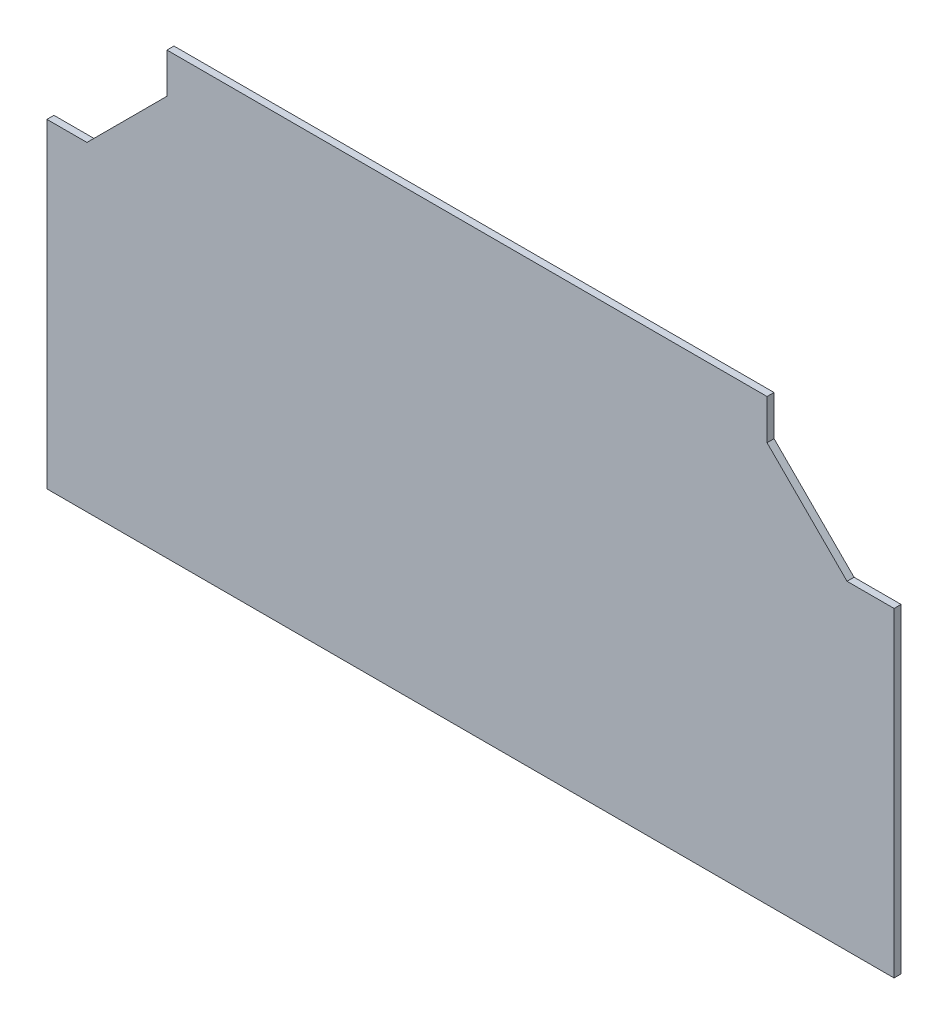
ISO-10303-21;
HEADER;
FILE_DESCRIPTION(('STEP AP214'),'2;1');
FILE_NAME('part.step','',(''),(''),'','','');
FILE_SCHEMA(('AUTOMOTIVE_DESIGN { 1 0 10303 214 1 1 1 1 }'));
ENDSEC;
DATA;
#1=APPLICATION_CONTEXT('core data for automotive mechanical design processes');
#2=APPLICATION_PROTOCOL_DEFINITION('international standard','automotive_design',2000,#1);
#3=PRODUCT_CONTEXT('',#1,'mechanical');
#4=PRODUCT('Part','Part','',(#3));
#5=PRODUCT_RELATED_PRODUCT_CATEGORY('part','',(#4));
#6=PRODUCT_DEFINITION_FORMATION('','',#4);
#7=PRODUCT_DEFINITION_CONTEXT('part definition',#1,'design');
#8=PRODUCT_DEFINITION('design','',#6,#7);
#9=PRODUCT_DEFINITION_SHAPE('','',#8);
#10=(LENGTH_UNIT() NAMED_UNIT(*) SI_UNIT(.MILLI.,.METRE.));
#11=(NAMED_UNIT(*) PLANE_ANGLE_UNIT() SI_UNIT($,.RADIAN.));
#12=(NAMED_UNIT(*) SI_UNIT($,.STERADIAN.) SOLID_ANGLE_UNIT());
#13=UNCERTAINTY_MEASURE_WITH_UNIT(LENGTH_MEASURE(1.E-05),#10,'distance_accuracy_value','');
#14=(GEOMETRIC_REPRESENTATION_CONTEXT(3) GLOBAL_UNCERTAINTY_ASSIGNED_CONTEXT((#13)) GLOBAL_UNIT_ASSIGNED_CONTEXT((#10,
#11,#12)) REPRESENTATION_CONTEXT('',''));
#15=CARTESIAN_POINT('',(0.,0.,0.));
#16=DIRECTION('',(0.,0.,1.));
#17=DIRECTION('',(1.,0.,0.));
#18=AXIS2_PLACEMENT_3D('',#15,#16,#17);
#19=CARTESIAN_POINT('',(423.500000000001,-60.0000000000006,3.5));
#20=DIRECTION('',(-1.,0.,0.));
#21=DIRECTION('',(0.,-1.,0.));
#22=AXIS2_PLACEMENT_3D('',#19,#20,#21);
#23=PLANE('',#22);
#24=DIRECTION('',(0.,1.,0.));
#25=VECTOR('',#24,1.);
#26=CARTESIAN_POINT('',(423.500000000001,-60.0000000000006,0.));
#27=LINE('',#26,#25);
#28=CARTESIAN_POINT('',(423.5,-220.,0.));
#29=VERTEX_POINT('',#28);
#30=CARTESIAN_POINT('',(423.500000000001,-60.0000000000006,0.));
#31=VERTEX_POINT('',#30);
#32=EDGE_CURVE('E140',#29,#31,#27,.T.);
#33=ORIENTED_EDGE('',*,*,#32,.T.);
#34=DIRECTION('',(0.,0.,-1.));
#35=VECTOR('',#34,1.);
#36=CARTESIAN_POINT('',(423.500000000001,-60.0000000000006,3.5));
#37=LINE('',#36,#35);
#38=CARTESIAN_POINT('',(423.500000000001,-60.0000000000006,3.5));
#39=VERTEX_POINT('',#38);
#40=EDGE_CURVE('E11',#39,#31,#37,.T.);
#41=ORIENTED_EDGE('',*,*,#40,.F.);
#42=DIRECTION('',(0.,1.,0.));
#43=VECTOR('',#42,1.);
#44=CARTESIAN_POINT('',(423.500000000001,-60.0000000000006,3.5));
#45=LINE('',#44,#43);
#46=CARTESIAN_POINT('',(423.5,-220.,3.5));
#47=VERTEX_POINT('',#46);
#48=EDGE_CURVE('E158',#47,#39,#45,.T.);
#49=ORIENTED_EDGE('',*,*,#48,.F.);
#50=DIRECTION('',(0.,0.,-1.));
#51=VECTOR('',#50,1.);
#52=CARTESIAN_POINT('',(423.5,-220.,3.5));
#53=LINE('',#52,#51);
#54=EDGE_CURVE('E136',#47,#29,#53,.T.);
#55=ORIENTED_EDGE('',*,*,#54,.T.);
#56=EDGE_LOOP('',(#33,#41,#49,#55));
#57=FACE_BOUND('',#56,.T.);
#58=ADVANCED_FACE('F32',(#57),#23,.F.);
#59=CARTESIAN_POINT('',(400.000000000001,-59.9999999999997,3.5));
#60=DIRECTION('',(0.,-1.,0.));
#61=DIRECTION('',(1.,0.,0.));
#62=AXIS2_PLACEMENT_3D('',#59,#60,#61);
#63=PLANE('',#62);
#64=DIRECTION('',(-1.,0.,0.));
#65=VECTOR('',#64,1.);
#66=CARTESIAN_POINT('',(400.000000000001,-59.9999999999997,0.));
#67=LINE('',#66,#65);
#68=CARTESIAN_POINT('',(400.000000000001,-59.9999999999997,0.));
#69=VERTEX_POINT('',#68);
#70=EDGE_CURVE('E143',#31,#69,#67,.T.);
#71=ORIENTED_EDGE('',*,*,#70,.T.);
#72=DIRECTION('',(0.,0.,-1.));
#73=VECTOR('',#72,1.);
#74=CARTESIAN_POINT('',(400.000000000001,-59.9999999999997,3.5));
#75=LINE('',#74,#73);
#76=CARTESIAN_POINT('',(400.000000000001,-59.9999999999997,3.5));
#77=VERTEX_POINT('',#76);
#78=EDGE_CURVE('E40',#77,#69,#75,.T.);
#79=ORIENTED_EDGE('',*,*,#78,.F.);
#80=DIRECTION('',(-1.,0.,0.));
#81=VECTOR('',#80,1.);
#82=CARTESIAN_POINT('',(400.000000000001,-59.9999999999997,3.5));
#83=LINE('',#82,#81);
#84=EDGE_CURVE('E97',#39,#77,#83,.T.);
#85=ORIENTED_EDGE('',*,*,#84,.F.);
#86=ORIENTED_EDGE('',*,*,#40,.T.);
#87=EDGE_LOOP('',(#71,#79,#85,#86));
#88=FACE_BOUND('',#87,.T.);
#89=ADVANCED_FACE('F207',(#88),#63,.F.);
#90=CARTESIAN_POINT('',(360.,-19.9999999999996,3.5));
#91=DIRECTION('',(-0.707106781186539,-0.707106781186556,0.));
#92=DIRECTION('',(0.707106781186556,-0.707106781186539,0.));
#93=AXIS2_PLACEMENT_3D('',#90,#91,#92);
#94=PLANE('',#93);
#95=DIRECTION('',(-0.707106781186556,0.707106781186539,0.));
#96=VECTOR('',#95,1.);
#97=CARTESIAN_POINT('',(360.,-19.9999999999996,0.));
#98=LINE('',#97,#96);
#99=CARTESIAN_POINT('',(360.,-19.9999999999996,0.));
#100=VERTEX_POINT('',#99);
#101=EDGE_CURVE('E145',#69,#100,#98,.T.);
#102=ORIENTED_EDGE('',*,*,#101,.T.);
#103=DIRECTION('',(0.,0.,-1.));
#104=VECTOR('',#103,1.);
#105=CARTESIAN_POINT('',(360.,-19.9999999999996,3.5));
#106=LINE('',#105,#104);
#107=CARTESIAN_POINT('',(360.,-19.9999999999996,3.5));
#108=VERTEX_POINT('',#107);
#109=EDGE_CURVE('E171',#108,#100,#106,.T.);
#110=ORIENTED_EDGE('',*,*,#109,.F.);
#111=DIRECTION('',(-0.707106781186556,0.707106781186539,0.));
#112=VECTOR('',#111,1.);
#113=CARTESIAN_POINT('',(360.,-19.9999999999996,3.5));
#114=LINE('',#113,#112);
#115=EDGE_CURVE('E179',#77,#108,#114,.T.);
#116=ORIENTED_EDGE('',*,*,#115,.F.);
#117=ORIENTED_EDGE('',*,*,#78,.T.);
#118=EDGE_LOOP('',(#102,#110,#116,#117));
#119=FACE_BOUND('',#118,.T.);
#120=ADVANCED_FACE('F177',(#119),#94,.F.);
#121=CARTESIAN_POINT('',(360.,3.74779527702149E-13,3.5));
#122=DIRECTION('',(-1.,0.,0.));
#123=DIRECTION('',(0.,-1.,0.));
#124=AXIS2_PLACEMENT_3D('',#121,#122,#123);
#125=PLANE('',#124);
#126=DIRECTION('',(0.,1.,0.));
#127=VECTOR('',#126,1.);
#128=CARTESIAN_POINT('',(360.,3.74779527702149E-13,0.));
#129=LINE('',#128,#127);
#130=CARTESIAN_POINT('',(360.,3.74779527702149E-13,0.));
#131=VERTEX_POINT('',#130);
#132=EDGE_CURVE('E147',#100,#131,#129,.T.);
#133=ORIENTED_EDGE('',*,*,#132,.T.);
#134=DIRECTION('',(0.,0.,-1.));
#135=VECTOR('',#134,1.);
#136=CARTESIAN_POINT('',(360.,3.74779527702149E-13,3.5));
#137=LINE('',#136,#135);
#138=CARTESIAN_POINT('',(360.,3.74779527702149E-13,3.5));
#139=VERTEX_POINT('',#138);
#140=EDGE_CURVE('E168',#139,#131,#137,.T.);
#141=ORIENTED_EDGE('',*,*,#140,.F.);
#142=DIRECTION('',(0.,1.,0.));
#143=VECTOR('',#142,1.);
#144=CARTESIAN_POINT('',(360.,3.74779527702149E-13,3.5));
#145=LINE('',#144,#143);
#146=EDGE_CURVE('E197',#108,#139,#145,.T.);
#147=ORIENTED_EDGE('',*,*,#146,.F.);
#148=ORIENTED_EDGE('',*,*,#109,.T.);
#149=EDGE_LOOP('',(#133,#141,#147,#148));
#150=FACE_BOUND('',#149,.T.);
#151=ADVANCED_FACE('F188',(#150),#125,.F.);
#152=CARTESIAN_POINT('',(60.,0.,3.5));
#153=DIRECTION('',(0.,-1.,0.));
#154=DIRECTION('',(1.,0.,0.));
#155=AXIS2_PLACEMENT_3D('',#152,#153,#154);
#156=PLANE('',#155);
#157=DIRECTION('',(-1.,0.,0.));
#158=VECTOR('',#157,1.);
#159=CARTESIAN_POINT('',(60.,0.,0.));
#160=LINE('',#159,#158);
#161=CARTESIAN_POINT('',(60.,0.,0.));
#162=VERTEX_POINT('',#161);
#163=EDGE_CURVE('E149',#131,#162,#160,.T.);
#164=ORIENTED_EDGE('',*,*,#163,.T.);
#165=DIRECTION('',(0.,0.,-1.));
#166=VECTOR('',#165,1.);
#167=CARTESIAN_POINT('',(60.,0.,3.5));
#168=LINE('',#167,#166);
#169=CARTESIAN_POINT('',(60.,0.,3.5));
#170=VERTEX_POINT('',#169);
#171=EDGE_CURVE('E165',#170,#162,#168,.T.);
#172=ORIENTED_EDGE('',*,*,#171,.F.);
#173=DIRECTION('',(-1.,0.,0.));
#174=VECTOR('',#173,1.);
#175=CARTESIAN_POINT('',(60.,0.,3.5));
#176=LINE('',#175,#174);
#177=EDGE_CURVE('E194',#139,#170,#176,.T.);
#178=ORIENTED_EDGE('',*,*,#177,.F.);
#179=ORIENTED_EDGE('',*,*,#140,.T.);
#180=EDGE_LOOP('',(#164,#172,#178,#179));
#181=FACE_BOUND('',#180,.T.);
#182=ADVANCED_FACE('F192',(#181),#156,.F.);
#183=CARTESIAN_POINT('',(60.,0.,3.5));
#184=DIRECTION('',(1.,0.,0.));
#185=DIRECTION('',(0.,1.,0.));
#186=AXIS2_PLACEMENT_3D('',#183,#184,#185);
#187=PLANE('',#186);
#188=DIRECTION('',(0.,-1.,0.));
#189=VECTOR('',#188,1.);
#190=CARTESIAN_POINT('',(60.,0.,0.));
#191=LINE('',#190,#189);
#192=CARTESIAN_POINT('',(60.,-19.9999999999999,0.));
#193=VERTEX_POINT('',#192);
#194=EDGE_CURVE('E151',#162,#193,#191,.T.);
#195=ORIENTED_EDGE('',*,*,#194,.T.);
#196=DIRECTION('',(0.,0.,-1.));
#197=VECTOR('',#196,1.);
#198=CARTESIAN_POINT('',(60.,-19.9999999999999,3.5));
#199=LINE('',#198,#197);
#200=CARTESIAN_POINT('',(60.,-19.9999999999999,3.5));
#201=VERTEX_POINT('',#200);
#202=EDGE_CURVE('E162',#201,#193,#199,.T.);
#203=ORIENTED_EDGE('',*,*,#202,.F.);
#204=DIRECTION('',(0.,-1.,0.));
#205=VECTOR('',#204,1.);
#206=CARTESIAN_POINT('',(60.,0.,3.5));
#207=LINE('',#206,#205);
#208=EDGE_CURVE('E196',#170,#201,#207,.T.);
#209=ORIENTED_EDGE('',*,*,#208,.F.);
#210=ORIENTED_EDGE('',*,*,#171,.T.);
#211=EDGE_LOOP('',(#195,#203,#209,#210));
#212=FACE_BOUND('',#211,.T.);
#213=ADVANCED_FACE('F219',(#212),#187,.F.);
#214=CARTESIAN_POINT('',(20.0000000000003,-60.,3.5));
#215=DIRECTION('',(0.70710678118655,-0.707106781186545,0.));
#216=DIRECTION('',(0.707106781186545,0.70710678118655,0.));
#217=AXIS2_PLACEMENT_3D('',#214,#215,#216);
#218=PLANE('',#217);
#219=DIRECTION('',(-0.707106781186545,-0.70710678118655,0.));
#220=VECTOR('',#219,1.);
#221=CARTESIAN_POINT('',(20.0000000000003,-60.,0.));
#222=LINE('',#221,#220);
#223=CARTESIAN_POINT('',(20.0000000000003,-60.,0.));
#224=VERTEX_POINT('',#223);
#225=EDGE_CURVE('E153',#193,#224,#222,.T.);
#226=ORIENTED_EDGE('',*,*,#225,.T.);
#227=DIRECTION('',(0.,0.,-1.));
#228=VECTOR('',#227,1.);
#229=CARTESIAN_POINT('',(20.0000000000003,-60.,3.5));
#230=LINE('',#229,#228);
#231=CARTESIAN_POINT('',(20.0000000000003,-60.,3.5));
#232=VERTEX_POINT('',#231);
#233=EDGE_CURVE('E131',#232,#224,#230,.T.);
#234=ORIENTED_EDGE('',*,*,#233,.F.);
#235=DIRECTION('',(-0.707106781186545,-0.70710678118655,0.));
#236=VECTOR('',#235,1.);
#237=CARTESIAN_POINT('',(20.0000000000003,-60.,3.5));
#238=LINE('',#237,#236);
#239=EDGE_CURVE('E122',#201,#232,#238,.T.);
#240=ORIENTED_EDGE('',*,*,#239,.F.);
#241=ORIENTED_EDGE('',*,*,#202,.T.);
#242=EDGE_LOOP('',(#226,#234,#240,#241));
#243=FACE_BOUND('',#242,.T.);
#244=ADVANCED_FACE('F222',(#243),#218,.F.);
#245=CARTESIAN_POINT('',(2.8163481665879E-13,-60.,3.5));
#246=DIRECTION('',(0.,-1.,0.));
#247=DIRECTION('',(1.,0.,0.));
#248=AXIS2_PLACEMENT_3D('',#245,#246,#247);
#249=PLANE('',#248);
#250=DIRECTION('',(-1.,0.,0.));
#251=VECTOR('',#250,1.);
#252=CARTESIAN_POINT('',(2.8163481665879E-13,-60.,0.));
#253=LINE('',#252,#251);
#254=CARTESIAN_POINT('',(2.8163481665879E-13,-60.,0.));
#255=VERTEX_POINT('',#254);
#256=EDGE_CURVE('E130',#224,#255,#253,.T.);
#257=ORIENTED_EDGE('',*,*,#256,.T.);
#258=DIRECTION('',(0.,0.,-1.));
#259=VECTOR('',#258,1.);
#260=CARTESIAN_POINT('',(2.8163481665879E-13,-60.,3.5));
#261=LINE('',#260,#259);
#262=CARTESIAN_POINT('',(2.8163481665879E-13,-60.,3.5));
#263=VERTEX_POINT('',#262);
#264=EDGE_CURVE('E127',#263,#255,#261,.T.);
#265=ORIENTED_EDGE('',*,*,#264,.F.);
#266=DIRECTION('',(-1.,0.,0.));
#267=VECTOR('',#266,1.);
#268=CARTESIAN_POINT('',(2.8163481665879E-13,-60.,3.5));
#269=LINE('',#268,#267);
#270=EDGE_CURVE('E116',#232,#263,#269,.T.);
#271=ORIENTED_EDGE('',*,*,#270,.F.);
#272=ORIENTED_EDGE('',*,*,#233,.T.);
#273=EDGE_LOOP('',(#257,#265,#271,#272));
#274=FACE_BOUND('',#273,.T.);
#275=ADVANCED_FACE('F128',(#274),#249,.F.);
#276=CARTESIAN_POINT('',(2.8163481665879E-13,-60.,3.5));
#277=DIRECTION('',(1.,0.,0.));
#278=DIRECTION('',(0.,1.,0.));
#279=AXIS2_PLACEMENT_3D('',#276,#277,#278);
#280=PLANE('',#279);
#281=DIRECTION('',(0.,-1.,0.));
#282=VECTOR('',#281,1.);
#283=CARTESIAN_POINT('',(2.8163481665879E-13,-60.,0.));
#284=LINE('',#283,#282);
#285=CARTESIAN_POINT('',(0.,-220.,0.));
#286=VERTEX_POINT('',#285);
#287=EDGE_CURVE('E83',#255,#286,#284,.T.);
#288=ORIENTED_EDGE('',*,*,#287,.T.);
#289=DIRECTION('',(0.,0.,-1.));
#290=VECTOR('',#289,1.);
#291=CARTESIAN_POINT('',(0.,-220.,3.5));
#292=LINE('',#291,#290);
#293=CARTESIAN_POINT('',(0.,-220.,3.5));
#294=VERTEX_POINT('',#293);
#295=EDGE_CURVE('E132',#294,#286,#292,.T.);
#296=ORIENTED_EDGE('',*,*,#295,.F.);
#297=DIRECTION('',(0.,-1.,0.));
#298=VECTOR('',#297,1.);
#299=CARTESIAN_POINT('',(2.8163481665879E-13,-60.,3.5));
#300=LINE('',#299,#298);
#301=EDGE_CURVE('E120',#263,#294,#300,.T.);
#302=ORIENTED_EDGE('',*,*,#301,.F.);
#303=ORIENTED_EDGE('',*,*,#264,.T.);
#304=EDGE_LOOP('',(#288,#296,#302,#303));
#305=FACE_BOUND('',#304,.T.);
#306=ADVANCED_FACE('F134',(#305),#280,.F.);
#307=CARTESIAN_POINT('',(0.,-220.,3.5));
#308=DIRECTION('',(0.,1.,0.));
#309=DIRECTION('',(-1.,0.,0.));
#310=AXIS2_PLACEMENT_3D('',#307,#308,#309);
#311=PLANE('',#310);
#312=DIRECTION('',(1.,0.,0.));
#313=VECTOR('',#312,1.);
#314=CARTESIAN_POINT('',(0.,-220.,0.));
#315=LINE('',#314,#313);
#316=EDGE_CURVE('E89',#286,#29,#315,.T.);
#317=ORIENTED_EDGE('',*,*,#316,.T.);
#318=ORIENTED_EDGE('',*,*,#54,.F.);
#319=DIRECTION('',(1.,0.,0.));
#320=VECTOR('',#319,1.);
#321=CARTESIAN_POINT('',(0.,-220.,3.5));
#322=LINE('',#321,#320);
#323=EDGE_CURVE('E48',#294,#47,#322,.T.);
#324=ORIENTED_EDGE('',*,*,#323,.F.);
#325=ORIENTED_EDGE('',*,*,#295,.T.);
#326=EDGE_LOOP('',(#317,#318,#324,#325));
#327=FACE_BOUND('',#326,.T.);
#328=ADVANCED_FACE('F231',(#327),#311,.F.);
#329=CARTESIAN_POINT('',(0.,0.,3.5));
#330=DIRECTION('',(0.,0.,1.));
#331=DIRECTION('',(1.,0.,0.));
#332=AXIS2_PLACEMENT_3D('',#329,#330,#331);
#333=PLANE('',#332);
#334=ORIENTED_EDGE('',*,*,#48,.T.);
#335=ORIENTED_EDGE('',*,*,#84,.T.);
#336=ORIENTED_EDGE('',*,*,#115,.T.);
#337=ORIENTED_EDGE('',*,*,#146,.T.);
#338=ORIENTED_EDGE('',*,*,#177,.T.);
#339=ORIENTED_EDGE('',*,*,#208,.T.);
#340=ORIENTED_EDGE('',*,*,#239,.T.);
#341=ORIENTED_EDGE('',*,*,#270,.T.);
#342=ORIENTED_EDGE('',*,*,#301,.T.);
#343=ORIENTED_EDGE('',*,*,#323,.T.);
#344=EDGE_LOOP('',(#334,#335,#336,#337,#338,#339,#340,#341,#342,#343));
#345=FACE_BOUND('',#344,.T.);
#346=ADVANCED_FACE('F118',(#345),#333,.T.);
#347=CARTESIAN_POINT('',(0.,0.,0.));
#348=DIRECTION('',(0.,0.,1.));
#349=DIRECTION('',(1.,0.,0.));
#350=AXIS2_PLACEMENT_3D('',#347,#348,#349);
#351=PLANE('',#350);
#352=ORIENTED_EDGE('',*,*,#32,.F.);
#353=ORIENTED_EDGE('',*,*,#316,.F.);
#354=ORIENTED_EDGE('',*,*,#287,.F.);
#355=ORIENTED_EDGE('',*,*,#256,.F.);
#356=ORIENTED_EDGE('',*,*,#225,.F.);
#357=ORIENTED_EDGE('',*,*,#194,.F.);
#358=ORIENTED_EDGE('',*,*,#163,.F.);
#359=ORIENTED_EDGE('',*,*,#132,.F.);
#360=ORIENTED_EDGE('',*,*,#101,.F.);
#361=ORIENTED_EDGE('',*,*,#70,.F.);
#362=EDGE_LOOP('',(#352,#353,#354,#355,#356,#357,#358,#359,#360,#361));
#363=FACE_BOUND('',#362,.T.);
#364=ADVANCED_FACE('F183',(#363),#351,.F.);
#365=CLOSED_SHELL('',(#58,#89,#120,#151,#182,#213,#244,#275,#306,#328,#346,#364));
#366=MANIFOLD_SOLID_BREP('B2',#365);
#367=ADVANCED_BREP_SHAPE_REPRESENTATION('',(#18,#366),#14);
#368=SHAPE_DEFINITION_REPRESENTATION(#9,#367);
ENDSEC;
END-ISO-10303-21;
